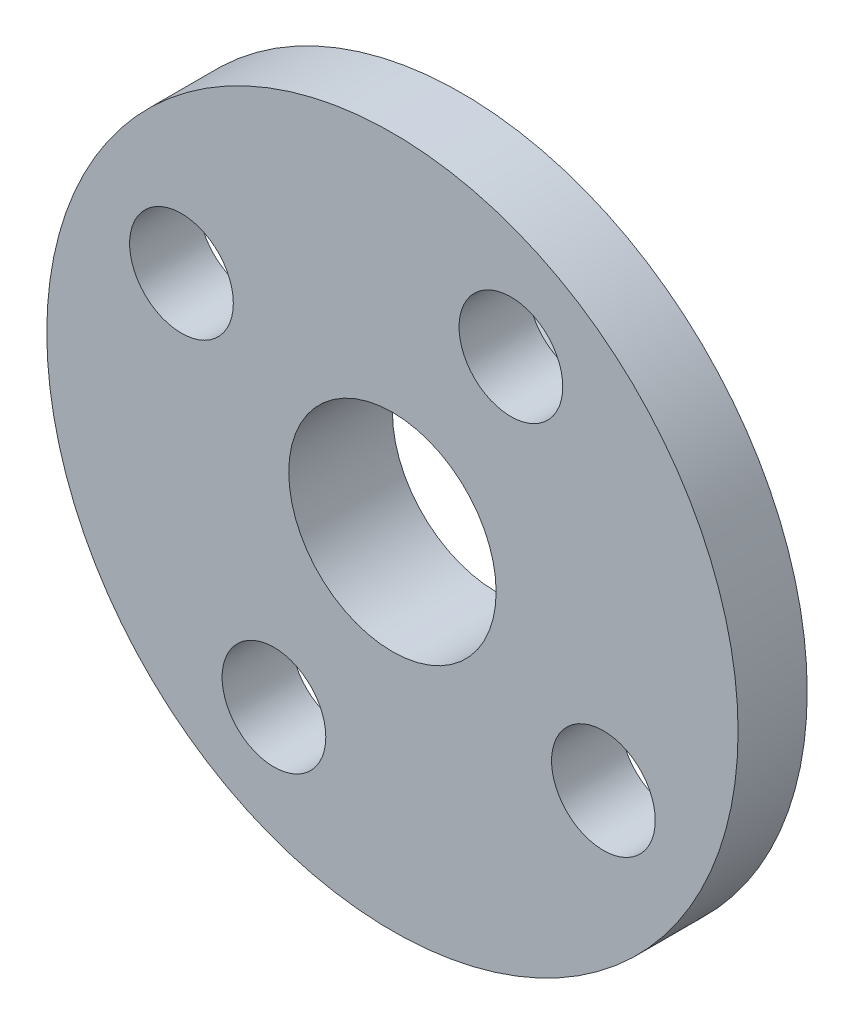
ISO-10303-21;
HEADER;
FILE_DESCRIPTION(('STEP AP214'),'2;1');
FILE_NAME('part.step','',(''),(''),'','','');
FILE_SCHEMA(('AUTOMOTIVE_DESIGN { 1 0 10303 214 1 1 1 1 }'));
ENDSEC;
DATA;
#1=APPLICATION_CONTEXT('core data for automotive mechanical design processes');
#2=APPLICATION_PROTOCOL_DEFINITION('international standard','automotive_design',2000,#1);
#3=PRODUCT_CONTEXT('',#1,'mechanical');
#4=PRODUCT('Part','Part','',(#3));
#5=PRODUCT_RELATED_PRODUCT_CATEGORY('part','',(#4));
#6=PRODUCT_DEFINITION_FORMATION('','',#4);
#7=PRODUCT_DEFINITION_CONTEXT('part definition',#1,'design');
#8=PRODUCT_DEFINITION('design','',#6,#7);
#9=PRODUCT_DEFINITION_SHAPE('','',#8);
#10=(LENGTH_UNIT() NAMED_UNIT(*) SI_UNIT(.MILLI.,.METRE.));
#11=(NAMED_UNIT(*) PLANE_ANGLE_UNIT() SI_UNIT($,.RADIAN.));
#12=(NAMED_UNIT(*) SI_UNIT($,.STERADIAN.) SOLID_ANGLE_UNIT());
#13=UNCERTAINTY_MEASURE_WITH_UNIT(LENGTH_MEASURE(1.E-05),#10,'distance_accuracy_value','');
#14=(GEOMETRIC_REPRESENTATION_CONTEXT(3) GLOBAL_UNCERTAINTY_ASSIGNED_CONTEXT((#13)) GLOBAL_UNIT_ASSIGNED_CONTEXT((#10,
#11,#12)) REPRESENTATION_CONTEXT('',''));
#15=CARTESIAN_POINT('',(0.,0.,0.));
#16=DIRECTION('',(0.,0.,1.));
#17=DIRECTION('',(1.,0.,0.));
#18=AXIS2_PLACEMENT_3D('',#15,#16,#17);
#19=CARTESIAN_POINT('',(0.,0.,0.));
#20=DIRECTION('',(0.,0.,1.));
#21=DIRECTION('',(1.,0.,0.));
#22=AXIS2_PLACEMENT_3D('',#19,#20,#21);
#23=PLANE('',#22);
#24=CARTESIAN_POINT('',(0.,0.,0.));
#25=DIRECTION('',(0.,0.,1.));
#26=DIRECTION('',(1.,0.,0.));
#27=AXIS2_PLACEMENT_3D('',#24,#25,#26);
#28=CIRCLE('',#27,5.);
#29=CARTESIAN_POINT('',(5.,0.,0.));
#30=VERTEX_POINT('',#29);
#31=EDGE_CURVE('E50',#30,#30,#28,.T.);
#32=ORIENTED_EDGE('',*,*,#31,.F.);
#33=EDGE_LOOP('',(#32));
#34=FACE_BOUND('',#33,.T.);
#35=CARTESIAN_POINT('',(0.,0.,0.));
#36=DIRECTION('',(0.,0.,1.));
#37=DIRECTION('',(1.,0.,0.));
#38=AXIS2_PLACEMENT_3D('',#35,#36,#37);
#39=CIRCLE('',#38,3.);
#40=CARTESIAN_POINT('',(3.,0.,0.));
#41=VERTEX_POINT('',#40);
#42=EDGE_CURVE('E56',#41,#41,#39,.T.);
#43=ORIENTED_EDGE('',*,*,#42,.T.);
#44=EDGE_LOOP('',(#43));
#45=FACE_BOUND('',#44,.T.);
#46=ADVANCED_FACE('F41',(#34,#45),#23,.F.);
#47=CARTESIAN_POINT('',(0.,0.,1.));
#48=DIRECTION('',(0.,0.,-1.));
#49=DIRECTION('',(-1.,0.,0.));
#50=AXIS2_PLACEMENT_3D('',#47,#48,#49);
#51=CYLINDRICAL_SURFACE('',#50,5.);
#52=CARTESIAN_POINT('',(0.,0.,1.));
#53=DIRECTION('',(0.,0.,1.));
#54=DIRECTION('',(1.,0.,0.));
#55=AXIS2_PLACEMENT_3D('',#52,#53,#54);
#56=CIRCLE('',#55,5.);
#57=CARTESIAN_POINT('',(5.,0.,1.));
#58=VERTEX_POINT('',#57);
#59=EDGE_CURVE('E10',#58,#58,#56,.T.);
#60=ORIENTED_EDGE('',*,*,#59,.F.);
#61=EDGE_LOOP('',(#60));
#62=FACE_BOUND('',#61,.T.);
#63=ORIENTED_EDGE('',*,*,#31,.T.);
#64=EDGE_LOOP('',(#63));
#65=FACE_BOUND('',#64,.T.);
#66=ADVANCED_FACE('F43',(#62,#65),#51,.T.);
#67=CARTESIAN_POINT('',(0.,0.,1.));
#68=DIRECTION('',(0.,0.,-1.));
#69=DIRECTION('',(-1.,0.,0.));
#70=AXIS2_PLACEMENT_3D('',#67,#68,#69);
#71=CYLINDRICAL_SURFACE('',#70,3.);
#72=ORIENTED_EDGE('',*,*,#42,.F.);
#73=EDGE_LOOP('',(#72));
#74=FACE_BOUND('',#73,.T.);
#75=CARTESIAN_POINT('',(0.,0.,3.));
#76=DIRECTION('',(0.,0.,1.));
#77=DIRECTION('',(1.,0.,0.));
#78=AXIS2_PLACEMENT_3D('',#75,#76,#77);
#79=CIRCLE('',#78,3.);
#80=CARTESIAN_POINT('',(3.,0.,3.));
#81=VERTEX_POINT('',#80);
#82=EDGE_CURVE('E76',#81,#81,#79,.T.);
#83=ORIENTED_EDGE('',*,*,#82,.T.);
#84=EDGE_LOOP('',(#83));
#85=FACE_BOUND('',#84,.T.);
#86=ADVANCED_FACE('F100',(#74,#85),#71,.F.);
#87=CARTESIAN_POINT('',(0.,0.,3.));
#88=DIRECTION('',(0.,0.,1.));
#89=DIRECTION('',(1.,0.,0.));
#90=AXIS2_PLACEMENT_3D('',#87,#88,#89);
#91=PLANE('',#90);
#92=CARTESIAN_POINT('',(-6.10340315276369,3.42760411290953,3.));
#93=DIRECTION('',(0.,0.,1.));
#94=DIRECTION('',(1.,0.,0.));
#95=AXIS2_PLACEMENT_3D('',#92,#93,#94);
#96=CIRCLE('',#95,1.5);
#97=CARTESIAN_POINT('',(-4.60340315276369,3.42760411290953,3.));
#98=VERTEX_POINT('',#97);
#99=EDGE_CURVE('E222',#98,#98,#96,.T.);
#100=ORIENTED_EDGE('',*,*,#99,.F.);
#101=EDGE_LOOP('',(#100));
#102=FACE_BOUND('',#101,.T.);
#103=CARTESIAN_POINT('',(-3.42760411290951,-6.1034031527637,3.));
#104=DIRECTION('',(0.,0.,1.));
#105=DIRECTION('',(1.,0.,0.));
#106=AXIS2_PLACEMENT_3D('',#103,#104,#105);
#107=CIRCLE('',#106,1.5);
#108=CARTESIAN_POINT('',(-1.92760411290951,-6.1034031527637,3.));
#109=VERTEX_POINT('',#108);
#110=EDGE_CURVE('E224',#109,#109,#107,.T.);
#111=ORIENTED_EDGE('',*,*,#110,.F.);
#112=EDGE_LOOP('',(#111));
#113=FACE_BOUND('',#112,.T.);
#114=CARTESIAN_POINT('',(6.10340315276371,-3.42760411290949,3.));
#115=DIRECTION('',(0.,0.,1.));
#116=DIRECTION('',(1.,0.,0.));
#117=AXIS2_PLACEMENT_3D('',#114,#115,#116);
#118=CIRCLE('',#117,1.5);
#119=CARTESIAN_POINT('',(7.60340315276371,-3.42760411290949,3.));
#120=VERTEX_POINT('',#119);
#121=EDGE_CURVE('E227',#120,#120,#118,.T.);
#122=ORIENTED_EDGE('',*,*,#121,.F.);
#123=EDGE_LOOP('',(#122));
#124=FACE_BOUND('',#123,.T.);
#125=CARTESIAN_POINT('',(3.42760411290947,6.10340315276372,3.));
#126=DIRECTION('',(0.,0.,1.));
#127=DIRECTION('',(1.,0.,0.));
#128=AXIS2_PLACEMENT_3D('',#125,#126,#127);
#129=CIRCLE('',#128,1.5);
#130=CARTESIAN_POINT('',(4.92760411290947,6.10340315276372,3.));
#131=VERTEX_POINT('',#130);
#132=EDGE_CURVE('E66',#131,#131,#129,.T.);
#133=ORIENTED_EDGE('',*,*,#132,.F.);
#134=EDGE_LOOP('',(#133));
#135=FACE_BOUND('',#134,.T.);
#136=CARTESIAN_POINT('',(0.,0.,3.));
#137=DIRECTION('',(0.,0.,1.));
#138=DIRECTION('',(1.,0.,0.));
#139=AXIS2_PLACEMENT_3D('',#136,#137,#138);
#140=CIRCLE('',#139,10.);
#141=CARTESIAN_POINT('',(10.,0.,3.));
#142=VERTEX_POINT('',#141);
#143=EDGE_CURVE('E87',#142,#142,#140,.T.);
#144=ORIENTED_EDGE('',*,*,#143,.T.);
#145=EDGE_LOOP('',(#144));
#146=FACE_BOUND('',#145,.T.);
#147=ORIENTED_EDGE('',*,*,#82,.F.);
#148=EDGE_LOOP('',(#147));
#149=FACE_BOUND('',#148,.T.);
#150=ADVANCED_FACE('F102',(#102,#113,#124,#135,#146,#149),#91,.T.);
#151=CARTESIAN_POINT('',(0.,0.,1.));
#152=DIRECTION('',(0.,0.,1.));
#153=DIRECTION('',(1.,0.,0.));
#154=AXIS2_PLACEMENT_3D('',#151,#152,#153);
#155=PLANE('',#154);
#156=CARTESIAN_POINT('',(-6.10340315276369,3.42760411290953,1.));
#157=DIRECTION('',(0.,0.,1.));
#158=DIRECTION('',(1.,0.,0.));
#159=AXIS2_PLACEMENT_3D('',#156,#157,#158);
#160=CIRCLE('',#159,1.5);
#161=CARTESIAN_POINT('',(-4.60340315276369,3.42760411290953,1.));
#162=VERTEX_POINT('',#161);
#163=EDGE_CURVE('E45',#162,#162,#160,.T.);
#164=ORIENTED_EDGE('',*,*,#163,.T.);
#165=EDGE_LOOP('',(#164));
#166=FACE_BOUND('',#165,.T.);
#167=CARTESIAN_POINT('',(-3.42760411290951,-6.1034031527637,1.));
#168=DIRECTION('',(0.,0.,1.));
#169=DIRECTION('',(1.,0.,0.));
#170=AXIS2_PLACEMENT_3D('',#167,#168,#169);
#171=CIRCLE('',#170,1.5);
#172=CARTESIAN_POINT('',(-1.92760411290951,-6.1034031527637,1.));
#173=VERTEX_POINT('',#172);
#174=EDGE_CURVE('E69',#173,#173,#171,.T.);
#175=ORIENTED_EDGE('',*,*,#174,.T.);
#176=EDGE_LOOP('',(#175));
#177=FACE_BOUND('',#176,.T.);
#178=CARTESIAN_POINT('',(6.10340315276371,-3.42760411290949,1.));
#179=DIRECTION('',(0.,0.,1.));
#180=DIRECTION('',(1.,0.,0.));
#181=AXIS2_PLACEMENT_3D('',#178,#179,#180);
#182=CIRCLE('',#181,1.5);
#183=CARTESIAN_POINT('',(7.60340315276371,-3.42760411290949,1.));
#184=VERTEX_POINT('',#183);
#185=EDGE_CURVE('E65',#184,#184,#182,.T.);
#186=ORIENTED_EDGE('',*,*,#185,.T.);
#187=EDGE_LOOP('',(#186));
#188=FACE_BOUND('',#187,.T.);
#189=CARTESIAN_POINT('',(3.42760411290947,6.10340315276372,1.));
#190=DIRECTION('',(0.,0.,1.));
#191=DIRECTION('',(1.,0.,0.));
#192=AXIS2_PLACEMENT_3D('',#189,#190,#191);
#193=CIRCLE('',#192,1.5);
#194=CARTESIAN_POINT('',(4.92760411290947,6.10340315276372,1.));
#195=VERTEX_POINT('',#194);
#196=EDGE_CURVE('E61',#195,#195,#193,.T.);
#197=ORIENTED_EDGE('',*,*,#196,.T.);
#198=EDGE_LOOP('',(#197));
#199=FACE_BOUND('',#198,.T.);
#200=ORIENTED_EDGE('',*,*,#59,.T.);
#201=EDGE_LOOP('',(#200));
#202=FACE_BOUND('',#201,.T.);
#203=CARTESIAN_POINT('',(0.,0.,1.));
#204=DIRECTION('',(0.,0.,1.));
#205=DIRECTION('',(1.,0.,0.));
#206=AXIS2_PLACEMENT_3D('',#203,#204,#205);
#207=CIRCLE('',#206,10.);
#208=CARTESIAN_POINT('',(10.,0.,1.));
#209=VERTEX_POINT('',#208);
#210=EDGE_CURVE('E81',#209,#209,#207,.T.);
#211=ORIENTED_EDGE('',*,*,#210,.F.);
#212=EDGE_LOOP('',(#211));
#213=FACE_BOUND('',#212,.T.);
#214=ADVANCED_FACE('F108',(#166,#177,#188,#199,#202,#213),#155,.F.);
#215=CARTESIAN_POINT('',(0.,0.,3.));
#216=DIRECTION('',(0.,0.,-1.));
#217=DIRECTION('',(-1.,0.,0.));
#218=AXIS2_PLACEMENT_3D('',#215,#216,#217);
#219=CYLINDRICAL_SURFACE('',#218,10.);
#220=ORIENTED_EDGE('',*,*,#143,.F.);
#221=EDGE_LOOP('',(#220));
#222=FACE_BOUND('',#221,.T.);
#223=ORIENTED_EDGE('',*,*,#210,.T.);
#224=EDGE_LOOP('',(#223));
#225=FACE_BOUND('',#224,.T.);
#226=ADVANCED_FACE('F135',(#222,#225),#219,.T.);
#227=CARTESIAN_POINT('',(3.42760411290947,6.10340315276372,0.));
#228=DIRECTION('',(0.,0.,1.));
#229=DIRECTION('',(1.,0.,0.));
#230=AXIS2_PLACEMENT_3D('',#227,#228,#229);
#231=CYLINDRICAL_SURFACE('',#230,1.5);
#232=ORIENTED_EDGE('',*,*,#132,.T.);
#233=EDGE_LOOP('',(#232));
#234=FACE_BOUND('',#233,.T.);
#235=ORIENTED_EDGE('',*,*,#196,.F.);
#236=EDGE_LOOP('',(#235));
#237=FACE_BOUND('',#236,.T.);
#238=ADVANCED_FACE('F140',(#234,#237),#231,.F.);
#239=CARTESIAN_POINT('',(6.10340315276371,-3.42760411290949,0.));
#240=DIRECTION('',(0.,0.,1.));
#241=DIRECTION('',(1.,0.,0.));
#242=AXIS2_PLACEMENT_3D('',#239,#240,#241);
#243=CYLINDRICAL_SURFACE('',#242,1.5);
#244=ORIENTED_EDGE('',*,*,#121,.T.);
#245=EDGE_LOOP('',(#244));
#246=FACE_BOUND('',#245,.T.);
#247=ORIENTED_EDGE('',*,*,#185,.F.);
#248=EDGE_LOOP('',(#247));
#249=FACE_BOUND('',#248,.T.);
#250=ADVANCED_FACE('F165',(#246,#249),#243,.F.);
#251=CARTESIAN_POINT('',(-3.42760411290951,-6.1034031527637,0.));
#252=DIRECTION('',(0.,0.,1.));
#253=DIRECTION('',(1.,0.,0.));
#254=AXIS2_PLACEMENT_3D('',#251,#252,#253);
#255=CYLINDRICAL_SURFACE('',#254,1.5);
#256=ORIENTED_EDGE('',*,*,#110,.T.);
#257=EDGE_LOOP('',(#256));
#258=FACE_BOUND('',#257,.T.);
#259=ORIENTED_EDGE('',*,*,#174,.F.);
#260=EDGE_LOOP('',(#259));
#261=FACE_BOUND('',#260,.T.);
#262=ADVANCED_FACE('F176',(#258,#261),#255,.F.);
#263=CARTESIAN_POINT('',(-6.10340315276369,3.42760411290953,0.));
#264=DIRECTION('',(0.,0.,1.));
#265=DIRECTION('',(1.,0.,0.));
#266=AXIS2_PLACEMENT_3D('',#263,#264,#265);
#267=CYLINDRICAL_SURFACE('',#266,1.5);
#268=ORIENTED_EDGE('',*,*,#99,.T.);
#269=EDGE_LOOP('',(#268));
#270=FACE_BOUND('',#269,.T.);
#271=ORIENTED_EDGE('',*,*,#163,.F.);
#272=EDGE_LOOP('',(#271));
#273=FACE_BOUND('',#272,.T.);
#274=ADVANCED_FACE('F187',(#270,#273),#267,.F.);
#275=CLOSED_SHELL('',(#46,#66,#86,#150,#214,#226,#238,#250,#262,#274));
#276=MANIFOLD_SOLID_BREP('B2',#275);
#277=ADVANCED_BREP_SHAPE_REPRESENTATION('',(#18,#276),#14);
#278=SHAPE_DEFINITION_REPRESENTATION(#9,#277);
ENDSEC;
END-ISO-10303-21;
